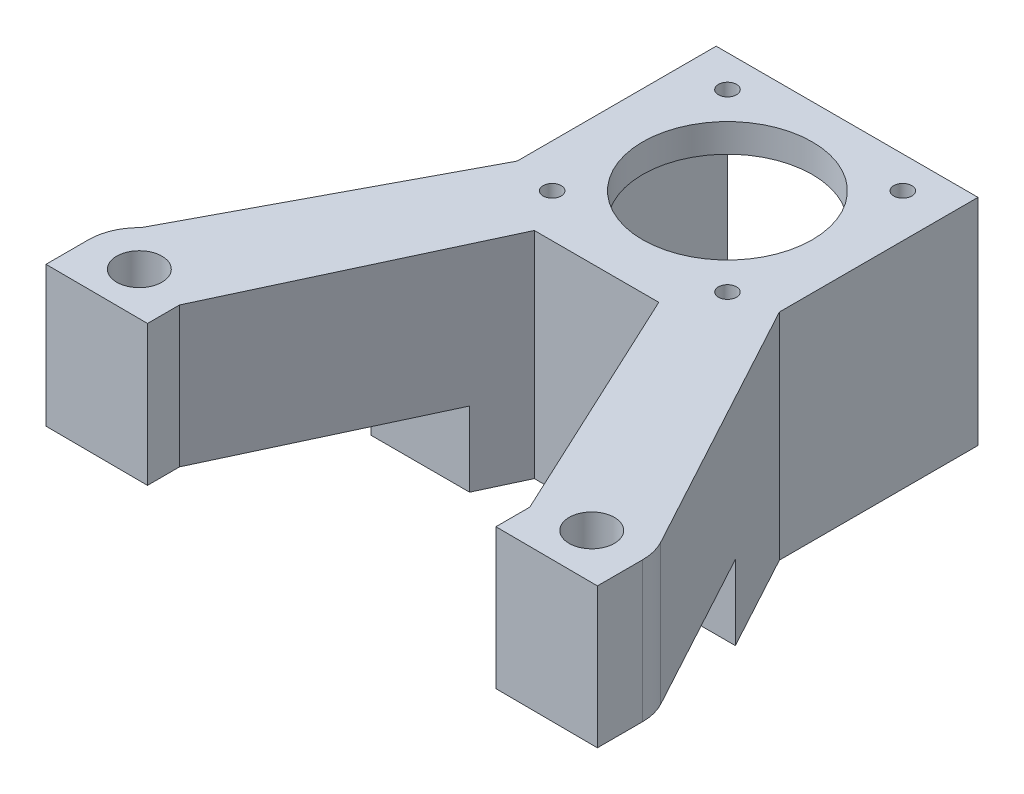
ISO-10303-21;
HEADER;
FILE_DESCRIPTION(('STEP AP214'),'2;1');
FILE_NAME('part.step','',(''),(''),'','','');
FILE_SCHEMA(('AUTOMOTIVE_DESIGN { 1 0 10303 214 1 1 1 1 }'));
ENDSEC;
DATA;
#1=APPLICATION_CONTEXT('core data for automotive mechanical design processes');
#2=APPLICATION_PROTOCOL_DEFINITION('international standard','automotive_design',2000,#1);
#3=PRODUCT_CONTEXT('',#1,'mechanical');
#4=PRODUCT('Part','Part','',(#3));
#5=PRODUCT_RELATED_PRODUCT_CATEGORY('part','',(#4));
#6=PRODUCT_DEFINITION_FORMATION('','',#4);
#7=PRODUCT_DEFINITION_CONTEXT('part definition',#1,'design');
#8=PRODUCT_DEFINITION('design','',#6,#7);
#9=PRODUCT_DEFINITION_SHAPE('','',#8);
#10=(LENGTH_UNIT() NAMED_UNIT(*) SI_UNIT(.MILLI.,.METRE.));
#11=(NAMED_UNIT(*) PLANE_ANGLE_UNIT() SI_UNIT($,.RADIAN.));
#12=(NAMED_UNIT(*) SI_UNIT($,.STERADIAN.) SOLID_ANGLE_UNIT());
#13=UNCERTAINTY_MEASURE_WITH_UNIT(LENGTH_MEASURE(1.E-05),#10,'distance_accuracy_value','');
#14=(GEOMETRIC_REPRESENTATION_CONTEXT(3) GLOBAL_UNCERTAINTY_ASSIGNED_CONTEXT((#13)) GLOBAL_UNIT_ASSIGNED_CONTEXT((#10,
#11,#12)) REPRESENTATION_CONTEXT('',''));
#15=CARTESIAN_POINT('',(0.,0.,0.));
#16=DIRECTION('',(0.,0.,1.));
#17=DIRECTION('',(1.,0.,0.));
#18=AXIS2_PLACEMENT_3D('',#15,#16,#17);
#19=CARTESIAN_POINT('',(49.,-33.,0.));
#20=DIRECTION('',(-1.,0.,0.));
#21=DIRECTION('',(0.,0.,1.));
#22=AXIS2_PLACEMENT_3D('',#19,#20,#21);
#23=PLANE('',#22);
#24=DIRECTION('',(0.,0.,1.));
#25=VECTOR('',#24,1.);
#26=CARTESIAN_POINT('',(49.,-19.8,0.));
#27=LINE('',#26,#25);
#28=CARTESIAN_POINT('',(49.,-19.8,64.));
#29=VERTEX_POINT('',#28);
#30=CARTESIAN_POINT('',(49.,-19.8,72.));
#31=VERTEX_POINT('',#30);
#32=EDGE_CURVE('E385',#29,#31,#27,.T.);
#33=ORIENTED_EDGE('',*,*,#32,.F.);
#34=DIRECTION('',(0.,1.,0.));
#35=VECTOR('',#34,1.);
#36=CARTESIAN_POINT('',(49.,-33.,64.));
#37=LINE('',#36,#35);
#38=CARTESIAN_POINT('',(49.,5.,64.));
#39=VERTEX_POINT('',#38);
#40=EDGE_CURVE('E282',#29,#39,#37,.T.);
#41=ORIENTED_EDGE('',*,*,#40,.T.);
#42=DIRECTION('',(0.,0.,1.));
#43=VECTOR('',#42,1.);
#44=CARTESIAN_POINT('',(49.,5.,0.));
#45=LINE('',#44,#43);
#46=CARTESIAN_POINT('',(49.,5.,72.));
#47=VERTEX_POINT('',#46);
#48=EDGE_CURVE('E285',#39,#47,#45,.T.);
#49=ORIENTED_EDGE('',*,*,#48,.T.);
#50=DIRECTION('',(0.,1.,0.));
#51=VECTOR('',#50,1.);
#52=CARTESIAN_POINT('',(49.,-33.,72.));
#53=LINE('',#52,#51);
#54=EDGE_CURVE('E302',#31,#47,#53,.T.);
#55=ORIENTED_EDGE('',*,*,#54,.F.);
#56=EDGE_LOOP('',(#33,#41,#49,#55));
#57=FACE_BOUND('',#56,.T.);
#58=ADVANCED_FACE('F37',(#57),#23,.F.);
#59=CARTESIAN_POINT('',(-0.366061899679813,-33.,71.7481323372465));
#60=DIRECTION('',(-0.00510197441246839,0.,0.99998698484385));
#61=DIRECTION('',(0.99998698484385,0.,0.00510197441246839));
#62=AXIS2_PLACEMENT_3D('',#59,#60,#61);
#63=PLANE('',#62);
#64=DIRECTION('',(0.,1.,0.));
#65=VECTOR('',#64,1.);
#66=CARTESIAN_POINT('',(30.9638982325282,-33.,71.9079790726149));
#67=LINE('',#66,#65);
#68=CARTESIAN_POINT('',(30.9638982325282,-19.8,71.9079790726149));
#69=VERTEX_POINT('',#68);
#70=CARTESIAN_POINT('',(30.9638982325282,5.,71.9079790726149));
#71=VERTEX_POINT('',#70);
#72=EDGE_CURVE('E305',#69,#71,#67,.T.);
#73=ORIENTED_EDGE('',*,*,#72,.F.);
#74=DIRECTION('',(0.99998698484385,0.,0.00510197441246839));
#75=VECTOR('',#74,1.);
#76=CARTESIAN_POINT('',(-0.366061899679813,-19.8,71.7481323372465));
#77=LINE('',#76,#75);
#78=EDGE_CURVE('E387',#69,#31,#77,.T.);
#79=ORIENTED_EDGE('',*,*,#78,.T.);
#80=ORIENTED_EDGE('',*,*,#54,.T.);
#81=DIRECTION('',(0.99998698484385,0.,0.00510197441246839));
#82=VECTOR('',#81,1.);
#83=CARTESIAN_POINT('',(-0.366061899679813,5.,71.7481323372465));
#84=LINE('',#83,#82);
#85=EDGE_CURVE('E275',#71,#47,#84,.T.);
#86=ORIENTED_EDGE('',*,*,#85,.F.);
#87=EDGE_LOOP('',(#73,#79,#80,#86));
#88=FACE_BOUND('',#87,.T.);
#89=ADVANCED_FACE('F478',(#88),#63,.T.);
#90=CARTESIAN_POINT('',(30.9638982325283,-33.,0.));
#91=DIRECTION('',(1.,0.,0.));
#92=DIRECTION('',(0.,0.,-1.));
#93=AXIS2_PLACEMENT_3D('',#90,#91,#92);
#94=PLANE('',#93);
#95=DIRECTION('',(0.,0.,-1.));
#96=VECTOR('',#95,1.);
#97=CARTESIAN_POINT('',(30.9638982325283,-19.8,0.));
#98=LINE('',#97,#96);
#99=CARTESIAN_POINT('',(30.9638982325282,-19.8,65.9194183730972));
#100=VERTEX_POINT('',#99);
#101=EDGE_CURVE('E390',#69,#100,#98,.T.);
#102=ORIENTED_EDGE('',*,*,#101,.F.);
#103=ORIENTED_EDGE('',*,*,#72,.T.);
#104=DIRECTION('',(0.,0.,-1.));
#105=VECTOR('',#104,1.);
#106=CARTESIAN_POINT('',(30.9638982325283,5.,0.));
#107=LINE('',#106,#105);
#108=CARTESIAN_POINT('',(30.9638982325282,5.,65.9194183730972));
#109=VERTEX_POINT('',#108);
#110=EDGE_CURVE('E297',#71,#109,#107,.T.);
#111=ORIENTED_EDGE('',*,*,#110,.T.);
#112=DIRECTION('',(0.,1.,0.));
#113=VECTOR('',#112,1.);
#114=CARTESIAN_POINT('',(30.9638982325282,-33.,65.9194183730972));
#115=LINE('',#114,#113);
#116=EDGE_CURVE('E307',#100,#109,#115,.T.);
#117=ORIENTED_EDGE('',*,*,#116,.F.);
#118=EDGE_LOOP('',(#102,#103,#111,#117));
#119=FACE_BOUND('',#118,.T.);
#120=ADVANCED_FACE('F484',(#119),#94,.F.);
#121=CARTESIAN_POINT('',(40.,-33.,64.));
#122=DIRECTION('',(0.,1.,0.));
#123=DIRECTION('',(0.,0.,1.));
#124=AXIS2_PLACEMENT_3D('',#121,#122,#123);
#125=CYLINDRICAL_SURFACE('',#124,4.);
#126=CARTESIAN_POINT('',(40.,5.,64.));
#127=DIRECTION('',(0.,1.,0.));
#128=DIRECTION('',(0.,0.,1.));
#129=AXIS2_PLACEMENT_3D('',#126,#127,#128);
#130=CIRCLE('',#129,4.);
#131=CARTESIAN_POINT('',(40.,5.,68.));
#132=VERTEX_POINT('',#131);
#133=EDGE_CURVE('E262',#132,#132,#130,.T.);
#134=ORIENTED_EDGE('',*,*,#133,.T.);
#135=EDGE_LOOP('',(#134));
#136=FACE_BOUND('',#135,.T.);
#137=CARTESIAN_POINT('',(40.,-19.8,64.));
#138=DIRECTION('',(0.,-1.,0.));
#139=DIRECTION('',(0.,0.,-1.));
#140=AXIS2_PLACEMENT_3D('',#137,#138,#139);
#141=CIRCLE('',#140,4.);
#142=CARTESIAN_POINT('',(40.,-19.8,60.));
#143=VERTEX_POINT('',#142);
#144=EDGE_CURVE('E209',#143,#143,#141,.F.);
#145=ORIENTED_EDGE('',*,*,#144,.F.);
#146=EDGE_LOOP('',(#145));
#147=FACE_BOUND('',#146,.T.);
#148=ADVANCED_FACE('F492',(#136,#147),#125,.F.);
#149=CARTESIAN_POINT('',(40.,-33.,64.));
#150=DIRECTION('',(0.,1.,0.));
#151=DIRECTION('',(0.,0.,1.));
#152=AXIS2_PLACEMENT_3D('',#149,#150,#151);
#153=CYLINDRICAL_SURFACE('',#152,8.99999999999998);
#154=ORIENTED_EDGE('',*,*,#40,.F.);
#155=CARTESIAN_POINT('',(40.,-19.8,64.));
#156=DIRECTION('',(0.,-1.,0.));
#157=DIRECTION('',(0.,0.,-1.));
#158=AXIS2_PLACEMENT_3D('',#155,#156,#157);
#159=CIRCLE('',#158,8.99999999999998);
#160=CARTESIAN_POINT('',(47.914593709124,-19.8,59.7152355467897));
#161=VERTEX_POINT('',#160);
#162=EDGE_CURVE('E375',#29,#161,#159,.F.);
#163=ORIENTED_EDGE('',*,*,#162,.T.);
#164=DIRECTION('',(0.,1.,0.));
#165=VECTOR('',#164,1.);
#166=CARTESIAN_POINT('',(47.914593709124,-33.,59.7152355467897));
#167=LINE('',#166,#165);
#168=CARTESIAN_POINT('',(47.914593709124,5.,59.7152355467897));
#169=VERTEX_POINT('',#168);
#170=EDGE_CURVE('E312',#161,#169,#167,.T.);
#171=ORIENTED_EDGE('',*,*,#170,.T.);
#172=CARTESIAN_POINT('',(40.,5.,64.));
#173=DIRECTION('',(0.,1.,0.));
#174=DIRECTION('',(0.,0.,1.));
#175=AXIS2_PLACEMENT_3D('',#172,#173,#174);
#176=CIRCLE('',#175,8.99999999999998);
#177=EDGE_CURVE('E288',#39,#169,#176,.T.);
#178=ORIENTED_EDGE('',*,*,#177,.F.);
#179=EDGE_LOOP('',(#154,#163,#171,#178));
#180=FACE_BOUND('',#179,.T.);
#181=ADVANCED_FACE('F490',(#180),#153,.T.);
#182=CARTESIAN_POINT('',(-30.9638982325283,-33.,0.));
#183=DIRECTION('',(-1.,0.,0.));
#184=DIRECTION('',(0.,0.,1.));
#185=AXIS2_PLACEMENT_3D('',#182,#183,#184);
#186=PLANE('',#185);
#187=DIRECTION('',(0.,0.,1.));
#188=VECTOR('',#187,1.);
#189=CARTESIAN_POINT('',(-30.9638982325283,-19.8,0.));
#190=LINE('',#189,#188);
#191=CARTESIAN_POINT('',(-30.9638982325283,-19.8,65.9194183730972));
#192=VERTEX_POINT('',#191);
#193=CARTESIAN_POINT('',(-30.9638982325283,-19.8,71.5920209273851));
#194=VERTEX_POINT('',#193);
#195=EDGE_CURVE('E377',#192,#194,#190,.T.);
#196=ORIENTED_EDGE('',*,*,#195,.F.);
#197=DIRECTION('',(0.,1.,0.));
#198=VECTOR('',#197,1.);
#199=CARTESIAN_POINT('',(-30.9638982325283,-33.,65.9194183730972));
#200=LINE('',#199,#198);
#201=CARTESIAN_POINT('',(-30.9638982325283,5.,65.9194183730972));
#202=VERTEX_POINT('',#201);
#203=EDGE_CURVE('E263',#192,#202,#200,.T.);
#204=ORIENTED_EDGE('',*,*,#203,.T.);
#205=DIRECTION('',(0.,0.,1.));
#206=VECTOR('',#205,1.);
#207=CARTESIAN_POINT('',(-30.9638982325283,5.,0.));
#208=LINE('',#207,#206);
#209=CARTESIAN_POINT('',(-30.9638982325283,5.,71.5920209273851));
#210=VERTEX_POINT('',#209);
#211=EDGE_CURVE('E233',#202,#210,#208,.T.);
#212=ORIENTED_EDGE('',*,*,#211,.T.);
#213=DIRECTION('',(0.,1.,0.));
#214=VECTOR('',#213,1.);
#215=CARTESIAN_POINT('',(-30.9638982325283,-33.,71.5920209273851));
#216=LINE('',#215,#214);
#217=EDGE_CURVE('E265',#194,#210,#216,.T.);
#218=ORIENTED_EDGE('',*,*,#217,.F.);
#219=EDGE_LOOP('',(#196,#204,#212,#218));
#220=FACE_BOUND('',#219,.T.);
#221=ADVANCED_FACE('F728',(#220),#186,.F.);
#222=CARTESIAN_POINT('',(-0.366061899679814,-33.,71.7481323372465));
#223=DIRECTION('',(-0.00510197441246841,0.,0.99998698484385));
#224=DIRECTION('',(0.99998698484385,0.,0.00510197441246841));
#225=AXIS2_PLACEMENT_3D('',#222,#223,#224);
#226=PLANE('',#225);
#227=DIRECTION('',(0.,1.,0.));
#228=VECTOR('',#227,1.);
#229=CARTESIAN_POINT('',(-49.,-33.,71.5));
#230=LINE('',#229,#228);
#231=CARTESIAN_POINT('',(-49.,-19.8,71.5));
#232=VERTEX_POINT('',#231);
#233=CARTESIAN_POINT('',(-49.,5.,71.5));
#234=VERTEX_POINT('',#233);
#235=EDGE_CURVE('E267',#232,#234,#230,.T.);
#236=ORIENTED_EDGE('',*,*,#235,.F.);
#237=DIRECTION('',(0.99998698484385,0.,0.00510197441246841));
#238=VECTOR('',#237,1.);
#239=CARTESIAN_POINT('',(-0.366061899679814,-19.8,71.7481323372465));
#240=LINE('',#239,#238);
#241=EDGE_CURVE('E834',#232,#194,#240,.T.);
#242=ORIENTED_EDGE('',*,*,#241,.T.);
#243=ORIENTED_EDGE('',*,*,#217,.T.);
#244=DIRECTION('',(0.99998698484385,0.,0.00510197441246841));
#245=VECTOR('',#244,1.);
#246=CARTESIAN_POINT('',(-0.366061899679814,5.,71.7481323372465));
#247=LINE('',#246,#245);
#248=EDGE_CURVE('E254',#234,#210,#247,.T.);
#249=ORIENTED_EDGE('',*,*,#248,.F.);
#250=EDGE_LOOP('',(#236,#242,#243,#249));
#251=FACE_BOUND('',#250,.T.);
#252=ADVANCED_FACE('F720',(#251),#226,.T.);
#253=CARTESIAN_POINT('',(-49.,-33.,0.));
#254=DIRECTION('',(-1.,0.,0.));
#255=DIRECTION('',(0.,0.,1.));
#256=AXIS2_PLACEMENT_3D('',#253,#254,#255);
#257=PLANE('',#256);
#258=DIRECTION('',(0.,1.,0.));
#259=VECTOR('',#258,1.);
#260=CARTESIAN_POINT('',(-49.,-33.,64.));
#261=LINE('',#260,#259);
#262=CARTESIAN_POINT('',(-49.,-19.8,64.));
#263=VERTEX_POINT('',#262);
#264=CARTESIAN_POINT('',(-49.,5.,64.));
#265=VERTEX_POINT('',#264);
#266=EDGE_CURVE('E269',#263,#265,#261,.T.);
#267=ORIENTED_EDGE('',*,*,#266,.F.);
#268=DIRECTION('',(0.,0.,1.));
#269=VECTOR('',#268,1.);
#270=CARTESIAN_POINT('',(-49.,-19.8,0.));
#271=LINE('',#270,#269);
#272=EDGE_CURVE('E60',#263,#232,#271,.T.);
#273=ORIENTED_EDGE('',*,*,#272,.T.);
#274=ORIENTED_EDGE('',*,*,#235,.T.);
#275=DIRECTION('',(0.,0.,1.));
#276=VECTOR('',#275,1.);
#277=CARTESIAN_POINT('',(-49.,5.,0.));
#278=LINE('',#277,#276);
#279=EDGE_CURVE('E251',#265,#234,#278,.T.);
#280=ORIENTED_EDGE('',*,*,#279,.F.);
#281=EDGE_LOOP('',(#267,#273,#274,#280));
#282=FACE_BOUND('',#281,.T.);
#283=ADVANCED_FACE('F362',(#282),#257,.T.);
#284=CARTESIAN_POINT('',(-40.,-33.,64.));
#285=DIRECTION('',(0.,1.,0.));
#286=DIRECTION('',(0.,0.,1.));
#287=AXIS2_PLACEMENT_3D('',#284,#285,#286);
#288=CYLINDRICAL_SURFACE('',#287,4.);
#289=CARTESIAN_POINT('',(-40.,5.,64.));
#290=DIRECTION('',(0.,1.,0.));
#291=DIRECTION('',(0.,0.,1.));
#292=AXIS2_PLACEMENT_3D('',#289,#290,#291);
#293=CIRCLE('',#292,4.);
#294=CARTESIAN_POINT('',(-40.,5.,68.));
#295=VERTEX_POINT('',#294);
#296=EDGE_CURVE('E242',#295,#295,#293,.T.);
#297=ORIENTED_EDGE('',*,*,#296,.T.);
#298=EDGE_LOOP('',(#297));
#299=FACE_BOUND('',#298,.T.);
#300=CARTESIAN_POINT('',(-40.,-19.8,64.));
#301=DIRECTION('',(0.,-1.,0.));
#302=DIRECTION('',(0.,0.,-1.));
#303=AXIS2_PLACEMENT_3D('',#300,#301,#302);
#304=CIRCLE('',#303,4.);
#305=CARTESIAN_POINT('',(-40.,-19.8,60.));
#306=VERTEX_POINT('',#305);
#307=EDGE_CURVE('E371',#306,#306,#304,.F.);
#308=ORIENTED_EDGE('',*,*,#307,.F.);
#309=EDGE_LOOP('',(#308));
#310=FACE_BOUND('',#309,.T.);
#311=ADVANCED_FACE('F704',(#299,#310),#288,.F.);
#312=CARTESIAN_POINT('',(-40.,-33.,64.));
#313=DIRECTION('',(0.,1.,0.));
#314=DIRECTION('',(0.,0.,1.));
#315=AXIS2_PLACEMENT_3D('',#312,#313,#314);
#316=CYLINDRICAL_SURFACE('',#315,9.);
#317=DIRECTION('',(0.,1.,0.));
#318=VECTOR('',#317,1.);
#319=CARTESIAN_POINT('',(-46.2022692479095,-33.,57.4783547952656));
#320=LINE('',#319,#318);
#321=CARTESIAN_POINT('',(-46.2022692479095,-19.8,57.4783547952656));
#322=VERTEX_POINT('',#321);
#323=CARTESIAN_POINT('',(-46.2022692479095,5.,57.4783547952656));
#324=VERTEX_POINT('',#323);
#325=EDGE_CURVE('E241',#322,#324,#320,.T.);
#326=ORIENTED_EDGE('',*,*,#325,.F.);
#327=CARTESIAN_POINT('',(-40.,-19.8,64.));
#328=DIRECTION('',(0.,-1.,0.));
#329=DIRECTION('',(0.,0.,-1.));
#330=AXIS2_PLACEMENT_3D('',#327,#328,#329);
#331=CIRCLE('',#330,9.);
#332=EDGE_CURVE('E45',#322,#263,#331,.F.);
#333=ORIENTED_EDGE('',*,*,#332,.T.);
#334=ORIENTED_EDGE('',*,*,#266,.T.);
#335=CARTESIAN_POINT('',(-40.,5.,64.));
#336=DIRECTION('',(0.,1.,0.));
#337=DIRECTION('',(0.,0.,1.));
#338=AXIS2_PLACEMENT_3D('',#335,#336,#337);
#339=CIRCLE('',#338,9.);
#340=EDGE_CURVE('E248',#324,#265,#339,.T.);
#341=ORIENTED_EDGE('',*,*,#340,.F.);
#342=EDGE_LOOP('',(#326,#333,#334,#341));
#343=FACE_BOUND('',#342,.T.);
#344=ADVANCED_FACE('F358',(#343),#316,.T.);
#345=CARTESIAN_POINT('',(0.,5.,0.));
#346=DIRECTION('',(0.,1.,0.));
#347=DIRECTION('',(0.,0.,1.));
#348=AXIS2_PLACEMENT_3D('',#345,#346,#347);
#349=PLANE('',#348);
#350=DIRECTION('',(0.,0.,1.));
#351=VECTOR('',#350,1.);
#352=CARTESIAN_POINT('',(-23.15,5.,21.15));
#353=LINE('',#352,#351);
#354=CARTESIAN_POINT('',(-23.15,5.,-21.15));
#355=VERTEX_POINT('',#354);
#356=CARTESIAN_POINT('',(-23.15,5.,14.0503679174957));
#357=VERTEX_POINT('',#356);
#358=EDGE_CURVE('E369',#355,#357,#353,.T.);
#359=ORIENTED_EDGE('',*,*,#358,.T.);
#360=DIRECTION('',(-0.468856217453364,0.,0.883274502833249));
#361=VECTOR('',#360,1.);
#362=CARTESIAN_POINT('',(-12.2423633707478,5.,-6.4984420633526));
#363=LINE('',#362,#361);
#364=EDGE_CURVE('E245',#357,#324,#363,.T.);
#365=ORIENTED_EDGE('',*,*,#364,.T.);
#366=ORIENTED_EDGE('',*,*,#340,.T.);
#367=ORIENTED_EDGE('',*,*,#279,.T.);
#368=ORIENTED_EDGE('',*,*,#248,.T.);
#369=ORIENTED_EDGE('',*,*,#211,.F.);
#370=DIRECTION('',(-0.422910363192941,0.,0.906171520576549));
#371=VECTOR('',#370,1.);
#372=CARTESIAN_POINT('',(-0.163652382515457,5.,-0.076376587605586));
#373=LINE('',#372,#371);
#374=CARTESIAN_POINT('',(-11.0034052717595,5.,23.15));
#375=VERTEX_POINT('',#374);
#376=EDGE_CURVE('E228',#375,#202,#373,.T.);
#377=ORIENTED_EDGE('',*,*,#376,.F.);
#378=DIRECTION('',(1.,0.,0.));
#379=VECTOR('',#378,1.);
#380=CARTESIAN_POINT('',(21.15,5.,23.15));
#381=LINE('',#380,#379);
#382=CARTESIAN_POINT('',(11.0034052717595,5.,23.15));
#383=VERTEX_POINT('',#382);
#384=EDGE_CURVE('E410',#375,#383,#381,.T.);
#385=ORIENTED_EDGE('',*,*,#384,.T.);
#386=DIRECTION('',(0.42291036319294,0.,0.906171520576549));
#387=VECTOR('',#386,1.);
#388=CARTESIAN_POINT('',(0.163652382515475,5.,-0.0763765876055947));
#389=LINE('',#388,#387);
#390=EDGE_CURVE('E294',#383,#109,#389,.T.);
#391=ORIENTED_EDGE('',*,*,#390,.T.);
#392=ORIENTED_EDGE('',*,*,#110,.F.);
#393=ORIENTED_EDGE('',*,*,#85,.T.);
#394=ORIENTED_EDGE('',*,*,#48,.F.);
#395=ORIENTED_EDGE('',*,*,#177,.T.);
#396=DIRECTION('',(0.476084939245589,0.,0.87939930101378));
#397=VECTOR('',#396,1.);
#398=CARTESIAN_POINT('',(12.0535181151364,5.,-6.52547532494617));
#399=LINE('',#398,#397);
#400=CARTESIAN_POINT('',(23.15,5.,13.9713680087752));
#401=VERTEX_POINT('',#400);
#402=EDGE_CURVE('E291',#401,#169,#399,.T.);
#403=ORIENTED_EDGE('',*,*,#402,.F.);
#404=DIRECTION('',(0.,0.,-1.));
#405=VECTOR('',#404,1.);
#406=CARTESIAN_POINT('',(23.15,5.,-21.15));
#407=LINE('',#406,#405);
#408=CARTESIAN_POINT('',(23.15,5.,-21.15));
#409=VERTEX_POINT('',#408);
#410=EDGE_CURVE('E423',#401,#409,#407,.T.);
#411=ORIENTED_EDGE('',*,*,#410,.T.);
#412=DIRECTION('',(-1.,0.,0.));
#413=VECTOR('',#412,1.);
#414=CARTESIAN_POINT('',(-21.15,5.,-21.15));
#415=LINE('',#414,#413);
#416=EDGE_CURVE('E345',#409,#355,#415,.T.);
#417=ORIENTED_EDGE('',*,*,#416,.T.);
#418=EDGE_LOOP('',(#359,#365,#366,#367,#368,#369,#377,#385,#391,#392,#393,#394,#395,#403,#411,#417));
#419=FACE_BOUND('',#418,.T.);
#420=ORIENTED_EDGE('',*,*,#296,.F.);
#421=EDGE_LOOP('',(#420));
#422=FACE_BOUND('',#421,.T.);
#423=CARTESIAN_POINT('',(15.5,5.,15.5));
#424=DIRECTION('',(0.,1.,0.));
#425=DIRECTION('',(0.,0.,1.));
#426=AXIS2_PLACEMENT_3D('',#423,#424,#425);
#427=CIRCLE('',#426,1.6);
#428=CARTESIAN_POINT('',(15.5,5.,17.1));
#429=VERTEX_POINT('',#428);
#430=EDGE_CURVE('E321',#429,#429,#427,.T.);
#431=ORIENTED_EDGE('',*,*,#430,.F.);
#432=EDGE_LOOP('',(#431));
#433=FACE_BOUND('',#432,.T.);
#434=CARTESIAN_POINT('',(-15.5,5.,-15.5));
#435=DIRECTION('',(0.,1.,0.));
#436=DIRECTION('',(0.,0.,1.));
#437=AXIS2_PLACEMENT_3D('',#434,#435,#436);
#438=CIRCLE('',#437,1.6);
#439=CARTESIAN_POINT('',(-15.5,5.,-13.9));
#440=VERTEX_POINT('',#439);
#441=EDGE_CURVE('E333',#440,#440,#438,.T.);
#442=ORIENTED_EDGE('',*,*,#441,.F.);
#443=EDGE_LOOP('',(#442));
#444=FACE_BOUND('',#443,.T.);
#445=CARTESIAN_POINT('',(15.5,5.,-15.5));
#446=DIRECTION('',(0.,1.,0.));
#447=DIRECTION('',(0.,0.,1.));
#448=AXIS2_PLACEMENT_3D('',#445,#446,#447);
#449=CIRCLE('',#448,1.6);
#450=CARTESIAN_POINT('',(15.5,5.,-13.9));
#451=VERTEX_POINT('',#450);
#452=EDGE_CURVE('E339',#451,#451,#449,.T.);
#453=ORIENTED_EDGE('',*,*,#452,.F.);
#454=EDGE_LOOP('',(#453));
#455=FACE_BOUND('',#454,.T.);
#456=CARTESIAN_POINT('',(-15.5,5.,15.5));
#457=DIRECTION('',(0.,1.,0.));
#458=DIRECTION('',(0.,0.,1.));
#459=AXIS2_PLACEMENT_3D('',#456,#457,#458);
#460=CIRCLE('',#459,1.6);
#461=CARTESIAN_POINT('',(-15.5,5.,17.1));
#462=VERTEX_POINT('',#461);
#463=EDGE_CURVE('E327',#462,#462,#460,.T.);
#464=ORIENTED_EDGE('',*,*,#463,.F.);
#465=EDGE_LOOP('',(#464));
#466=FACE_BOUND('',#465,.T.);
#467=CARTESIAN_POINT('',(0.,5.,0.));
#468=DIRECTION('',(0.,1.,0.));
#469=DIRECTION('',(0.,0.,1.));
#470=AXIS2_PLACEMENT_3D('',#467,#468,#469);
#471=CIRCLE('',#470,15.);
#472=CARTESIAN_POINT('',(0.,5.,15.));
#473=VERTEX_POINT('',#472);
#474=EDGE_CURVE('E315',#473,#473,#471,.T.);
#475=ORIENTED_EDGE('',*,*,#474,.F.);
#476=EDGE_LOOP('',(#475));
#477=FACE_BOUND('',#476,.T.);
#478=ORIENTED_EDGE('',*,*,#133,.F.);
#479=EDGE_LOOP('',(#478));
#480=FACE_BOUND('',#479,.T.);
#481=ADVANCED_FACE('F366',(#419,#422,#433,#444,#455,#466,#477,#480),#349,.T.);
#482=CARTESIAN_POINT('',(0.,0.,0.));
#483=DIRECTION('',(0.,1.,0.));
#484=DIRECTION('',(0.,0.,1.));
#485=AXIS2_PLACEMENT_3D('',#482,#483,#484);
#486=PLANE('',#485);
#487=DIRECTION('',(0.,0.,-1.));
#488=VECTOR('',#487,1.);
#489=CARTESIAN_POINT('',(21.15,0.,-21.15));
#490=LINE('',#489,#488);
#491=CARTESIAN_POINT('',(21.15,0.,21.15));
#492=VERTEX_POINT('',#491);
#493=CARTESIAN_POINT('',(21.15,0.,-21.15));
#494=VERTEX_POINT('',#493);
#495=EDGE_CURVE('E342',#492,#494,#490,.T.);
#496=ORIENTED_EDGE('',*,*,#495,.F.);
#497=DIRECTION('',(1.,0.,0.));
#498=VECTOR('',#497,1.);
#499=CARTESIAN_POINT('',(-21.15,0.,21.15));
#500=LINE('',#499,#498);
#501=CARTESIAN_POINT('',(-21.15,0.,21.15));
#502=VERTEX_POINT('',#501);
#503=EDGE_CURVE('E347',#502,#492,#500,.T.);
#504=ORIENTED_EDGE('',*,*,#503,.F.);
#505=DIRECTION('',(0.,0.,1.));
#506=VECTOR('',#505,1.);
#507=CARTESIAN_POINT('',(-21.15,0.,21.15));
#508=LINE('',#507,#506);
#509=CARTESIAN_POINT('',(-21.15,0.,-21.15));
#510=VERTEX_POINT('',#509);
#511=EDGE_CURVE('E352',#510,#502,#508,.T.);
#512=ORIENTED_EDGE('',*,*,#511,.F.);
#513=DIRECTION('',(-1.,0.,0.));
#514=VECTOR('',#513,1.);
#515=CARTESIAN_POINT('',(-21.15,0.,-21.15));
#516=LINE('',#515,#514);
#517=EDGE_CURVE('E349',#494,#510,#516,.T.);
#518=ORIENTED_EDGE('',*,*,#517,.F.);
#519=EDGE_LOOP('',(#496,#504,#512,#518));
#520=FACE_BOUND('',#519,.T.);
#521=CARTESIAN_POINT('',(15.5,0.,-15.5));
#522=DIRECTION('',(0.,1.,0.));
#523=DIRECTION('',(0.,0.,1.));
#524=AXIS2_PLACEMENT_3D('',#521,#522,#523);
#525=CIRCLE('',#524,1.6);
#526=CARTESIAN_POINT('',(15.5,0.,-13.9));
#527=VERTEX_POINT('',#526);
#528=EDGE_CURVE('E336',#527,#527,#525,.T.);
#529=ORIENTED_EDGE('',*,*,#528,.T.);
#530=EDGE_LOOP('',(#529));
#531=FACE_BOUND('',#530,.T.);
#532=CARTESIAN_POINT('',(-15.5,0.,-15.5));
#533=DIRECTION('',(0.,1.,0.));
#534=DIRECTION('',(0.,0.,1.));
#535=AXIS2_PLACEMENT_3D('',#532,#533,#534);
#536=CIRCLE('',#535,1.6);
#537=CARTESIAN_POINT('',(-15.5,0.,-13.9));
#538=VERTEX_POINT('',#537);
#539=EDGE_CURVE('E330',#538,#538,#536,.T.);
#540=ORIENTED_EDGE('',*,*,#539,.T.);
#541=EDGE_LOOP('',(#540));
#542=FACE_BOUND('',#541,.T.);
#543=CARTESIAN_POINT('',(-15.5,0.,15.5));
#544=DIRECTION('',(0.,1.,0.));
#545=DIRECTION('',(0.,0.,1.));
#546=AXIS2_PLACEMENT_3D('',#543,#544,#545);
#547=CIRCLE('',#546,1.6);
#548=CARTESIAN_POINT('',(-15.5,0.,17.1));
#549=VERTEX_POINT('',#548);
#550=EDGE_CURVE('E324',#549,#549,#547,.T.);
#551=ORIENTED_EDGE('',*,*,#550,.T.);
#552=EDGE_LOOP('',(#551));
#553=FACE_BOUND('',#552,.T.);
#554=CARTESIAN_POINT('',(15.5,0.,15.5));
#555=DIRECTION('',(0.,1.,0.));
#556=DIRECTION('',(0.,0.,1.));
#557=AXIS2_PLACEMENT_3D('',#554,#555,#556);
#558=CIRCLE('',#557,1.6);
#559=CARTESIAN_POINT('',(15.5,0.,17.1));
#560=VERTEX_POINT('',#559);
#561=EDGE_CURVE('E318',#560,#560,#558,.T.);
#562=ORIENTED_EDGE('',*,*,#561,.T.);
#563=EDGE_LOOP('',(#562));
#564=FACE_BOUND('',#563,.T.);
#565=CARTESIAN_POINT('',(0.,0.,0.));
#566=DIRECTION('',(0.,1.,0.));
#567=DIRECTION('',(0.,0.,1.));
#568=AXIS2_PLACEMENT_3D('',#565,#566,#567);
#569=CIRCLE('',#568,15.);
#570=CARTESIAN_POINT('',(0.,0.,15.));
#571=VERTEX_POINT('',#570);
#572=EDGE_CURVE('E304',#571,#571,#569,.T.);
#573=ORIENTED_EDGE('',*,*,#572,.T.);
#574=EDGE_LOOP('',(#573));
#575=FACE_BOUND('',#574,.T.);
#576=ADVANCED_FACE('F455',(#520,#531,#542,#553,#564,#575),#486,.F.);
#577=CARTESIAN_POINT('',(-21.15,5.,-21.15));
#578=DIRECTION('',(0.,0.,1.));
#579=DIRECTION('',(1.,0.,0.));
#580=AXIS2_PLACEMENT_3D('',#577,#578,#579);
#581=PLANE('',#580);
#582=ORIENTED_EDGE('',*,*,#517,.T.);
#583=DIRECTION('',(0.,1.,0.));
#584=VECTOR('',#583,1.);
#585=CARTESIAN_POINT('',(-21.15,-33.,-21.15));
#586=LINE('',#585,#584);
#587=CARTESIAN_POINT('',(-21.15,-33.,-21.15));
#588=VERTEX_POINT('',#587);
#589=EDGE_CURVE('E405',#588,#510,#586,.T.);
#590=ORIENTED_EDGE('',*,*,#589,.F.);
#591=DIRECTION('',(-1.,0.,0.));
#592=VECTOR('',#591,1.);
#593=CARTESIAN_POINT('',(-23.15,-33.,-21.15));
#594=LINE('',#593,#592);
#595=CARTESIAN_POINT('',(-23.15,-33.,-21.15));
#596=VERTEX_POINT('',#595);
#597=EDGE_CURVE('E400',#588,#596,#594,.T.);
#598=ORIENTED_EDGE('',*,*,#597,.T.);
#599=DIRECTION('',(0.,1.,0.));
#600=VECTOR('',#599,1.);
#601=CARTESIAN_POINT('',(-23.15,-33.,-21.15));
#602=LINE('',#601,#600);
#603=EDGE_CURVE('E407',#596,#355,#602,.T.);
#604=ORIENTED_EDGE('',*,*,#603,.T.);
#605=ORIENTED_EDGE('',*,*,#416,.F.);
#606=DIRECTION('',(0.,1.,0.));
#607=VECTOR('',#606,1.);
#608=CARTESIAN_POINT('',(23.15,-33.,-21.15));
#609=LINE('',#608,#607);
#610=CARTESIAN_POINT('',(23.15,-33.,-21.15));
#611=VERTEX_POINT('',#610);
#612=EDGE_CURVE('E429',#611,#409,#609,.T.);
#613=ORIENTED_EDGE('',*,*,#612,.F.);
#614=DIRECTION('',(-1.,0.,0.));
#615=VECTOR('',#614,1.);
#616=CARTESIAN_POINT('',(21.15,-33.,-21.15));
#617=LINE('',#616,#615);
#618=CARTESIAN_POINT('',(21.15,-33.,-21.15));
#619=VERTEX_POINT('',#618);
#620=EDGE_CURVE('E426',#611,#619,#617,.T.);
#621=ORIENTED_EDGE('',*,*,#620,.T.);
#622=DIRECTION('',(0.,1.,0.));
#623=VECTOR('',#622,1.);
#624=CARTESIAN_POINT('',(21.15,-33.,-21.15));
#625=LINE('',#624,#623);
#626=EDGE_CURVE('E432',#619,#494,#625,.T.);
#627=ORIENTED_EDGE('',*,*,#626,.T.);
#628=EDGE_LOOP('',(#582,#590,#598,#604,#605,#613,#621,#627));
#629=FACE_BOUND('',#628,.T.);
#630=ADVANCED_FACE('F39',(#629),#581,.F.);
#631=CARTESIAN_POINT('',(15.5,5.,-15.5));
#632=DIRECTION('',(0.,-1.,0.));
#633=DIRECTION('',(0.,0.,-1.));
#634=AXIS2_PLACEMENT_3D('',#631,#632,#633);
#635=CYLINDRICAL_SURFACE('',#634,1.6);
#636=ORIENTED_EDGE('',*,*,#452,.T.);
#637=EDGE_LOOP('',(#636));
#638=FACE_BOUND('',#637,.T.);
#639=ORIENTED_EDGE('',*,*,#528,.F.);
#640=EDGE_LOOP('',(#639));
#641=FACE_BOUND('',#640,.T.);
#642=ADVANCED_FACE('F511',(#638,#641),#635,.F.);
#643=CARTESIAN_POINT('',(-15.5,5.,-15.5));
#644=DIRECTION('',(0.,-1.,0.));
#645=DIRECTION('',(0.,0.,-1.));
#646=AXIS2_PLACEMENT_3D('',#643,#644,#645);
#647=CYLINDRICAL_SURFACE('',#646,1.6);
#648=ORIENTED_EDGE('',*,*,#441,.T.);
#649=EDGE_LOOP('',(#648));
#650=FACE_BOUND('',#649,.T.);
#651=ORIENTED_EDGE('',*,*,#539,.F.);
#652=EDGE_LOOP('',(#651));
#653=FACE_BOUND('',#652,.T.);
#654=ADVANCED_FACE('F507',(#650,#653),#647,.F.);
#655=CARTESIAN_POINT('',(-15.5,5.,15.5));
#656=DIRECTION('',(0.,-1.,0.));
#657=DIRECTION('',(0.,0.,-1.));
#658=AXIS2_PLACEMENT_3D('',#655,#656,#657);
#659=CYLINDRICAL_SURFACE('',#658,1.6);
#660=ORIENTED_EDGE('',*,*,#463,.T.);
#661=EDGE_LOOP('',(#660));
#662=FACE_BOUND('',#661,.T.);
#663=ORIENTED_EDGE('',*,*,#550,.F.);
#664=EDGE_LOOP('',(#663));
#665=FACE_BOUND('',#664,.T.);
#666=ADVANCED_FACE('F503',(#662,#665),#659,.F.);
#667=CARTESIAN_POINT('',(15.5,5.,15.5));
#668=DIRECTION('',(0.,-1.,0.));
#669=DIRECTION('',(0.,0.,-1.));
#670=AXIS2_PLACEMENT_3D('',#667,#668,#669);
#671=CYLINDRICAL_SURFACE('',#670,1.6);
#672=ORIENTED_EDGE('',*,*,#430,.T.);
#673=EDGE_LOOP('',(#672));
#674=FACE_BOUND('',#673,.T.);
#675=ORIENTED_EDGE('',*,*,#561,.F.);
#676=EDGE_LOOP('',(#675));
#677=FACE_BOUND('',#676,.T.);
#678=ADVANCED_FACE('F499',(#674,#677),#671,.F.);
#679=CARTESIAN_POINT('',(0.,5.,0.));
#680=DIRECTION('',(0.,-1.,0.));
#681=DIRECTION('',(0.,0.,-1.));
#682=AXIS2_PLACEMENT_3D('',#679,#680,#681);
#683=CYLINDRICAL_SURFACE('',#682,15.);
#684=ORIENTED_EDGE('',*,*,#474,.T.);
#685=EDGE_LOOP('',(#684));
#686=FACE_BOUND('',#685,.T.);
#687=ORIENTED_EDGE('',*,*,#572,.F.);
#688=EDGE_LOOP('',(#687));
#689=FACE_BOUND('',#688,.T.);
#690=ADVANCED_FACE('F496',(#686,#689),#683,.F.);
#691=CARTESIAN_POINT('',(0.,-33.,21.15));
#692=DIRECTION('',(0.,0.,1.));
#693=DIRECTION('',(1.,0.,0.));
#694=AXIS2_PLACEMENT_3D('',#691,#692,#693);
#695=PLANE('',#694);
#696=DIRECTION('',(1.,0.,0.));
#697=VECTOR('',#696,1.);
#698=CARTESIAN_POINT('',(0.,-33.,21.15));
#699=LINE('',#698,#697);
#700=CARTESIAN_POINT('',(-21.15,-33.,21.15));
#701=VERTEX_POINT('',#700);
#702=CARTESIAN_POINT('',(21.15,-33.,21.15));
#703=VERTEX_POINT('',#702);
#704=EDGE_CURVE('E277',#701,#703,#699,.T.);
#705=ORIENTED_EDGE('',*,*,#704,.F.);
#706=DIRECTION('',(0.,1.,0.));
#707=VECTOR('',#706,1.);
#708=CARTESIAN_POINT('',(-21.15,-33.,21.15));
#709=LINE('',#708,#707);
#710=EDGE_CURVE('E259',#701,#502,#709,.T.);
#711=ORIENTED_EDGE('',*,*,#710,.T.);
#712=ORIENTED_EDGE('',*,*,#503,.T.);
#713=DIRECTION('',(0.,1.,0.));
#714=VECTOR('',#713,1.);
#715=CARTESIAN_POINT('',(21.15,-33.,21.15));
#716=LINE('',#715,#714);
#717=EDGE_CURVE('E309',#703,#492,#716,.T.);
#718=ORIENTED_EDGE('',*,*,#717,.F.);
#719=EDGE_LOOP('',(#705,#711,#712,#718));
#720=FACE_BOUND('',#719,.T.);
#721=ADVANCED_FACE('F461',(#720),#695,.F.);
#722=CARTESIAN_POINT('',(21.15,-33.,0.));
#723=DIRECTION('',(1.,0.,0.));
#724=DIRECTION('',(0.,0.,-1.));
#725=AXIS2_PLACEMENT_3D('',#722,#723,#724);
#726=PLANE('',#725);
#727=ORIENTED_EDGE('',*,*,#717,.T.);
#728=ORIENTED_EDGE('',*,*,#495,.T.);
#729=ORIENTED_EDGE('',*,*,#626,.F.);
#730=DIRECTION('',(0.,0.,-1.));
#731=VECTOR('',#730,1.);
#732=CARTESIAN_POINT('',(21.15,-33.,0.));
#733=LINE('',#732,#731);
#734=EDGE_CURVE('E274',#703,#619,#733,.T.);
#735=ORIENTED_EDGE('',*,*,#734,.F.);
#736=EDGE_LOOP('',(#727,#728,#729,#735));
#737=FACE_BOUND('',#736,.T.);
#738=ADVANCED_FACE('F447',(#737),#726,.F.);
#739=CARTESIAN_POINT('',(0.163652382515475,-33.,-0.0763765876055947));
#740=DIRECTION('',(-0.906171520576549,0.,0.42291036319294));
#741=DIRECTION('',(0.42291036319294,0.,0.906171520576549));
#742=AXIS2_PLACEMENT_3D('',#739,#740,#741);
#743=PLANE('',#742);
#744=DIRECTION('',(0.,-1.,0.));
#745=VECTOR('',#744,1.);
#746=CARTESIAN_POINT('',(14.6452230775264,-33.,30.9533358033578));
#747=LINE('',#746,#745);
#748=CARTESIAN_POINT('',(14.6452230775264,-19.8,30.9533358033578));
#749=VERTEX_POINT('',#748);
#750=CARTESIAN_POINT('',(14.6452230775264,-33.,30.9533358033578));
#751=VERTEX_POINT('',#750);
#752=EDGE_CURVE('E52',#749,#751,#747,.T.);
#753=ORIENTED_EDGE('',*,*,#752,.F.);
#754=DIRECTION('',(0.42291036319294,0.,0.906171520576549));
#755=VECTOR('',#754,1.);
#756=CARTESIAN_POINT('',(0.163652382515475,-19.8,-0.0763765876055947));
#757=LINE('',#756,#755);
#758=EDGE_CURVE('E392',#749,#100,#757,.T.);
#759=ORIENTED_EDGE('',*,*,#758,.T.);
#760=ORIENTED_EDGE('',*,*,#116,.T.);
#761=ORIENTED_EDGE('',*,*,#390,.F.);
#762=DIRECTION('',(0.,1.,0.));
#763=VECTOR('',#762,1.);
#764=CARTESIAN_POINT('',(11.0034052717595,-33.,23.15));
#765=LINE('',#764,#763);
#766=CARTESIAN_POINT('',(11.0034052717595,-33.,23.15));
#767=VERTEX_POINT('',#766);
#768=EDGE_CURVE('E420',#767,#383,#765,.T.);
#769=ORIENTED_EDGE('',*,*,#768,.F.);
#770=DIRECTION('',(0.42291036319294,0.,0.906171520576549));
#771=VECTOR('',#770,1.);
#772=CARTESIAN_POINT('',(0.163652382515475,-33.,-0.0763765876055947));
#773=LINE('',#772,#771);
#774=EDGE_CURVE('E279',#767,#751,#773,.T.);
#775=ORIENTED_EDGE('',*,*,#774,.T.);
#776=EDGE_LOOP('',(#753,#759,#760,#761,#769,#775));
#777=FACE_BOUND('',#776,.T.);
#778=ADVANCED_FACE('F558',(#777),#743,.T.);
#779=CARTESIAN_POINT('',(12.0535181151364,-33.,-6.52547532494617));
#780=DIRECTION('',(-0.87939930101378,0.,0.476084939245588));
#781=DIRECTION('',(0.476084939245589,0.,0.87939930101378));
#782=AXIS2_PLACEMENT_3D('',#779,#780,#781);
#783=PLANE('',#782);
#784=DIRECTION('',(0.476084939245589,0.,0.87939930101378));
#785=VECTOR('',#784,1.);
#786=CARTESIAN_POINT('',(12.0535181151364,-19.8,-6.52547532494617));
#787=LINE('',#786,#785);
#788=CARTESIAN_POINT('',(32.3436155696668,-19.8,30.9533358033578));
#789=VERTEX_POINT('',#788);
#790=EDGE_CURVE('E383',#789,#161,#787,.T.);
#791=ORIENTED_EDGE('',*,*,#790,.F.);
#792=DIRECTION('',(0.,-1.,0.));
#793=VECTOR('',#792,1.);
#794=CARTESIAN_POINT('',(32.3436155696668,-33.,30.9533358033578));
#795=LINE('',#794,#793);
#796=CARTESIAN_POINT('',(32.3436155696668,-33.,30.9533358033578));
#797=VERTEX_POINT('',#796);
#798=EDGE_CURVE('E208',#789,#797,#795,.T.);
#799=ORIENTED_EDGE('',*,*,#798,.T.);
#800=DIRECTION('',(0.476084939245589,0.,0.87939930101378));
#801=VECTOR('',#800,1.);
#802=CARTESIAN_POINT('',(12.0535181151364,-33.,-6.52547532494617));
#803=LINE('',#802,#801);
#804=CARTESIAN_POINT('',(23.15,-33.,13.9713680087752));
#805=VERTEX_POINT('',#804);
#806=EDGE_CURVE('E272',#805,#797,#803,.T.);
#807=ORIENTED_EDGE('',*,*,#806,.F.);
#808=DIRECTION('',(0.,1.,0.));
#809=VECTOR('',#808,1.);
#810=CARTESIAN_POINT('',(23.15,-33.,13.9713680087752));
#811=LINE('',#810,#809);
#812=EDGE_CURVE('E236',#805,#401,#811,.T.);
#813=ORIENTED_EDGE('',*,*,#812,.T.);
#814=ORIENTED_EDGE('',*,*,#402,.T.);
#815=ORIENTED_EDGE('',*,*,#170,.F.);
#816=EDGE_LOOP('',(#791,#799,#807,#813,#814,#815));
#817=FACE_BOUND('',#816,.T.);
#818=ADVANCED_FACE('F565',(#817),#783,.F.);
#819=CARTESIAN_POINT('',(0.,-33.,0.));
#820=DIRECTION('',(0.,1.,0.));
#821=DIRECTION('',(0.,0.,1.));
#822=AXIS2_PLACEMENT_3D('',#819,#820,#821);
#823=PLANE('',#822);
#824=ORIENTED_EDGE('',*,*,#806,.T.);
#825=DIRECTION('',(1.,0.,0.));
#826=VECTOR('',#825,1.);
#827=CARTESIAN_POINT('',(62.0405256861147,-33.,30.9533358033578));
#828=LINE('',#827,#826);
#829=EDGE_CURVE('E221',#751,#797,#828,.T.);
#830=ORIENTED_EDGE('',*,*,#829,.F.);
#831=ORIENTED_EDGE('',*,*,#774,.F.);
#832=DIRECTION('',(1.,0.,0.));
#833=VECTOR('',#832,1.);
#834=CARTESIAN_POINT('',(21.15,-33.,23.15));
#835=LINE('',#834,#833);
#836=CARTESIAN_POINT('',(-11.0034052717595,-33.,23.15));
#837=VERTEX_POINT('',#836);
#838=EDGE_CURVE('E412',#837,#767,#835,.T.);
#839=ORIENTED_EDGE('',*,*,#838,.F.);
#840=DIRECTION('',(-0.422910363192941,0.,0.906171520576549));
#841=VECTOR('',#840,1.);
#842=CARTESIAN_POINT('',(-0.163652382515457,-33.,-0.076376587605586));
#843=LINE('',#842,#841);
#844=CARTESIAN_POINT('',(-14.6452230775264,-33.,30.9533358033578));
#845=VERTEX_POINT('',#844);
#846=EDGE_CURVE('E219',#837,#845,#843,.T.);
#847=ORIENTED_EDGE('',*,*,#846,.T.);
#848=CARTESIAN_POINT('',(-32.1223653986162,-33.,30.9533358033578));
#849=VERTEX_POINT('',#848);
#850=EDGE_CURVE('E202',#849,#845,#828,.T.);
#851=ORIENTED_EDGE('',*,*,#850,.F.);
#852=DIRECTION('',(-0.468856217453364,0.,0.883274502833249));
#853=VECTOR('',#852,1.);
#854=CARTESIAN_POINT('',(-12.2423633707478,-33.,-6.4984420633526));
#855=LINE('',#854,#853);
#856=CARTESIAN_POINT('',(-23.15,-33.,14.0503679174957));
#857=VERTEX_POINT('',#856);
#858=EDGE_CURVE('E217',#857,#849,#855,.T.);
#859=ORIENTED_EDGE('',*,*,#858,.F.);
#860=DIRECTION('',(0.,0.,1.));
#861=VECTOR('',#860,1.);
#862=CARTESIAN_POINT('',(-23.15,-33.,21.15));
#863=LINE('',#862,#861);
#864=EDGE_CURVE('E403',#596,#857,#863,.T.);
#865=ORIENTED_EDGE('',*,*,#864,.F.);
#866=ORIENTED_EDGE('',*,*,#597,.F.);
#867=DIRECTION('',(0.,0.,1.));
#868=VECTOR('',#867,1.);
#869=CARTESIAN_POINT('',(-21.15,-33.,0.));
#870=LINE('',#869,#868);
#871=EDGE_CURVE('E230',#588,#701,#870,.T.);
#872=ORIENTED_EDGE('',*,*,#871,.T.);
#873=ORIENTED_EDGE('',*,*,#704,.T.);
#874=ORIENTED_EDGE('',*,*,#734,.T.);
#875=ORIENTED_EDGE('',*,*,#620,.F.);
#876=DIRECTION('',(0.,0.,-1.));
#877=VECTOR('',#876,1.);
#878=CARTESIAN_POINT('',(23.15,-33.,-21.15));
#879=LINE('',#878,#877);
#880=EDGE_CURVE('E424',#805,#611,#879,.T.);
#881=ORIENTED_EDGE('',*,*,#880,.F.);
#882=EDGE_LOOP('',(#824,#830,#831,#839,#847,#851,#859,#865,#866,#872,#873,#874,#875,#881));
#883=FACE_BOUND('',#882,.T.);
#884=ADVANCED_FACE('F215',(#883),#823,.F.);
#885=CARTESIAN_POINT('',(-21.15,-33.,0.));
#886=DIRECTION('',(-1.,0.,0.));
#887=DIRECTION('',(0.,0.,1.));
#888=AXIS2_PLACEMENT_3D('',#885,#886,#887);
#889=PLANE('',#888);
#890=ORIENTED_EDGE('',*,*,#871,.F.);
#891=ORIENTED_EDGE('',*,*,#589,.T.);
#892=ORIENTED_EDGE('',*,*,#511,.T.);
#893=ORIENTED_EDGE('',*,*,#710,.F.);
#894=EDGE_LOOP('',(#890,#891,#892,#893));
#895=FACE_BOUND('',#894,.T.);
#896=ADVANCED_FACE('F459',(#895),#889,.F.);
#897=CARTESIAN_POINT('',(-12.2423633707478,-33.,-6.4984420633526));
#898=DIRECTION('',(-0.883274502833249,0.,-0.468856217453364));
#899=DIRECTION('',(-0.468856217453364,0.,0.88327450283325));
#900=AXIS2_PLACEMENT_3D('',#897,#898,#899);
#901=PLANE('',#900);
#902=DIRECTION('',(0.,-1.,0.));
#903=VECTOR('',#902,1.);
#904=CARTESIAN_POINT('',(-32.1223653986162,-33.,30.9533358033578));
#905=LINE('',#904,#903);
#906=CARTESIAN_POINT('',(-32.1223653986162,-19.8,30.9533358033578));
#907=VERTEX_POINT('',#906);
#908=EDGE_CURVE('E199',#907,#849,#905,.T.);
#909=ORIENTED_EDGE('',*,*,#908,.F.);
#910=DIRECTION('',(-0.468856217453364,0.,0.88327450283325));
#911=VECTOR('',#910,1.);
#912=CARTESIAN_POINT('',(-12.2423633707478,-19.8,-6.4984420633526));
#913=LINE('',#912,#911);
#914=EDGE_CURVE('E370',#907,#322,#913,.T.);
#915=ORIENTED_EDGE('',*,*,#914,.T.);
#916=ORIENTED_EDGE('',*,*,#325,.T.);
#917=ORIENTED_EDGE('',*,*,#364,.F.);
#918=DIRECTION('',(0.,1.,0.));
#919=VECTOR('',#918,1.);
#920=CARTESIAN_POINT('',(-23.15,-33.,14.0503679174957));
#921=LINE('',#920,#919);
#922=EDGE_CURVE('E227',#857,#357,#921,.T.);
#923=ORIENTED_EDGE('',*,*,#922,.F.);
#924=ORIENTED_EDGE('',*,*,#858,.T.);
#925=EDGE_LOOP('',(#909,#915,#916,#917,#923,#924));
#926=FACE_BOUND('',#925,.T.);
#927=ADVANCED_FACE('F224',(#926),#901,.T.);
#928=CARTESIAN_POINT('',(-0.163652382515457,-33.,-0.076376587605586));
#929=DIRECTION('',(-0.906171520576549,0.,-0.422910363192941));
#930=DIRECTION('',(-0.422910363192941,0.,0.906171520576549));
#931=AXIS2_PLACEMENT_3D('',#928,#929,#930);
#932=PLANE('',#931);
#933=DIRECTION('',(-0.422910363192941,0.,0.906171520576549));
#934=VECTOR('',#933,1.);
#935=CARTESIAN_POINT('',(-0.163652382515457,-19.8,-0.076376587605586));
#936=LINE('',#935,#934);
#937=CARTESIAN_POINT('',(-14.6452230775264,-19.8,30.9533358033578));
#938=VERTEX_POINT('',#937);
#939=EDGE_CURVE('E372',#938,#192,#936,.T.);
#940=ORIENTED_EDGE('',*,*,#939,.F.);
#941=DIRECTION('',(0.,-1.,0.));
#942=VECTOR('',#941,1.);
#943=CARTESIAN_POINT('',(-14.6452230775264,-33.,30.9533358033578));
#944=LINE('',#943,#942);
#945=EDGE_CURVE('E11',#938,#845,#944,.T.);
#946=ORIENTED_EDGE('',*,*,#945,.T.);
#947=ORIENTED_EDGE('',*,*,#846,.F.);
#948=DIRECTION('',(0.,1.,0.));
#949=VECTOR('',#948,1.);
#950=CARTESIAN_POINT('',(-11.0034052717595,-33.,23.15));
#951=LINE('',#950,#949);
#952=EDGE_CURVE('E415',#837,#375,#951,.T.);
#953=ORIENTED_EDGE('',*,*,#952,.T.);
#954=ORIENTED_EDGE('',*,*,#376,.T.);
#955=ORIENTED_EDGE('',*,*,#203,.F.);
#956=EDGE_LOOP('',(#940,#946,#947,#953,#954,#955));
#957=FACE_BOUND('',#956,.T.);
#958=ADVANCED_FACE('F591',(#957),#932,.F.);
#959=CARTESIAN_POINT('',(23.15,-33.,-21.15));
#960=DIRECTION('',(1.,0.,0.));
#961=DIRECTION('',(0.,0.,-1.));
#962=AXIS2_PLACEMENT_3D('',#959,#960,#961);
#963=PLANE('',#962);
#964=ORIENTED_EDGE('',*,*,#812,.F.);
#965=ORIENTED_EDGE('',*,*,#880,.T.);
#966=ORIENTED_EDGE('',*,*,#612,.T.);
#967=ORIENTED_EDGE('',*,*,#410,.F.);
#968=EDGE_LOOP('',(#964,#965,#966,#967));
#969=FACE_BOUND('',#968,.T.);
#970=ADVANCED_FACE('F439',(#969),#963,.T.);
#971=CARTESIAN_POINT('',(21.15,-33.,23.15));
#972=DIRECTION('',(0.,0.,1.));
#973=DIRECTION('',(1.,0.,0.));
#974=AXIS2_PLACEMENT_3D('',#971,#972,#973);
#975=PLANE('',#974);
#976=ORIENTED_EDGE('',*,*,#838,.T.);
#977=ORIENTED_EDGE('',*,*,#768,.T.);
#978=ORIENTED_EDGE('',*,*,#384,.F.);
#979=ORIENTED_EDGE('',*,*,#952,.F.);
#980=EDGE_LOOP('',(#976,#977,#978,#979));
#981=FACE_BOUND('',#980,.T.);
#982=ADVANCED_FACE('F466',(#981),#975,.T.);
#983=CARTESIAN_POINT('',(-23.15,-33.,21.15));
#984=DIRECTION('',(-1.,0.,0.));
#985=DIRECTION('',(0.,0.,1.));
#986=AXIS2_PLACEMENT_3D('',#983,#984,#985);
#987=PLANE('',#986);
#988=ORIENTED_EDGE('',*,*,#864,.T.);
#989=ORIENTED_EDGE('',*,*,#922,.T.);
#990=ORIENTED_EDGE('',*,*,#358,.F.);
#991=ORIENTED_EDGE('',*,*,#603,.F.);
#992=EDGE_LOOP('',(#988,#989,#990,#991));
#993=FACE_BOUND('',#992,.T.);
#994=ADVANCED_FACE('F463',(#993),#987,.T.);
#995=CARTESIAN_POINT('',(0.,-19.8,0.));
#996=DIRECTION('',(0.,-1.,0.));
#997=DIRECTION('',(0.,0.,-1.));
#998=AXIS2_PLACEMENT_3D('',#995,#996,#997);
#999=PLANE('',#998);
#1000=DIRECTION('',(1.,0.,0.));
#1001=VECTOR('',#1000,1.);
#1002=CARTESIAN_POINT('',(-8.60479923220581,-19.8,30.9533358033578));
#1003=LINE('',#1002,#1001);
#1004=EDGE_CURVE('E204',#907,#938,#1003,.T.);
#1005=ORIENTED_EDGE('',*,*,#1004,.T.);
#1006=ORIENTED_EDGE('',*,*,#939,.T.);
#1007=ORIENTED_EDGE('',*,*,#195,.T.);
#1008=ORIENTED_EDGE('',*,*,#241,.F.);
#1009=ORIENTED_EDGE('',*,*,#272,.F.);
#1010=ORIENTED_EDGE('',*,*,#332,.F.);
#1011=ORIENTED_EDGE('',*,*,#914,.F.);
#1012=EDGE_LOOP('',(#1005,#1006,#1007,#1008,#1009,#1010,#1011));
#1013=FACE_BOUND('',#1012,.T.);
#1014=ORIENTED_EDGE('',*,*,#307,.T.);
#1015=EDGE_LOOP('',(#1014));
#1016=FACE_BOUND('',#1015,.T.);
#1017=ADVANCED_FACE('F465',(#1013,#1016),#999,.T.);
#1018=CARTESIAN_POINT('',(62.0405256861147,-19.8,30.9533358033578));
#1019=DIRECTION('',(0.,0.,-1.));
#1020=DIRECTION('',(-1.,0.,0.));
#1021=AXIS2_PLACEMENT_3D('',#1018,#1019,#1020);
#1022=PLANE('',#1021);
#1023=ORIENTED_EDGE('',*,*,#908,.T.);
#1024=ORIENTED_EDGE('',*,*,#850,.T.);
#1025=ORIENTED_EDGE('',*,*,#945,.F.);
#1026=ORIENTED_EDGE('',*,*,#1004,.F.);
#1027=EDGE_LOOP('',(#1023,#1024,#1025,#1026));
#1028=FACE_BOUND('',#1027,.T.);
#1029=ADVANCED_FACE('F201',(#1028),#1022,.F.);
#1030=ORIENTED_EDGE('',*,*,#752,.T.);
#1031=ORIENTED_EDGE('',*,*,#829,.T.);
#1032=ORIENTED_EDGE('',*,*,#798,.F.);
#1033=EDGE_CURVE('E220',#749,#789,#1003,.T.);
#1034=ORIENTED_EDGE('',*,*,#1033,.F.);
#1035=EDGE_LOOP('',(#1030,#1031,#1032,#1034));
#1036=FACE_BOUND('',#1035,.T.);
#1037=ADVANCED_FACE('F784',(#1036),#1022,.F.);
#1038=ORIENTED_EDGE('',*,*,#1033,.T.);
#1039=ORIENTED_EDGE('',*,*,#790,.T.);
#1040=ORIENTED_EDGE('',*,*,#162,.F.);
#1041=ORIENTED_EDGE('',*,*,#32,.T.);
#1042=ORIENTED_EDGE('',*,*,#78,.F.);
#1043=ORIENTED_EDGE('',*,*,#101,.T.);
#1044=ORIENTED_EDGE('',*,*,#758,.F.);
#1045=EDGE_LOOP('',(#1038,#1039,#1040,#1041,#1042,#1043,#1044));
#1046=FACE_BOUND('',#1045,.T.);
#1047=ORIENTED_EDGE('',*,*,#144,.T.);
#1048=EDGE_LOOP('',(#1047));
#1049=FACE_BOUND('',#1048,.T.);
#1050=ADVANCED_FACE('F473',(#1046,#1049),#999,.T.);
#1051=CLOSED_SHELL('',(#58,#89,#120,#148,#181,#221,#252,#283,#311,#344,#481,#576,#630,#642,#654,
#666,#678,#690,#721,#738,#778,#818,#884,#896,#927,#958,#970,#982,#994,#1017,#1029,#1037,#1050));
#1052=MANIFOLD_SOLID_BREP('B2',#1051);
#1053=ADVANCED_BREP_SHAPE_REPRESENTATION('',(#18,#1052),#14);
#1054=SHAPE_DEFINITION_REPRESENTATION(#9,#1053);
ENDSEC;
END-ISO-10303-21;
